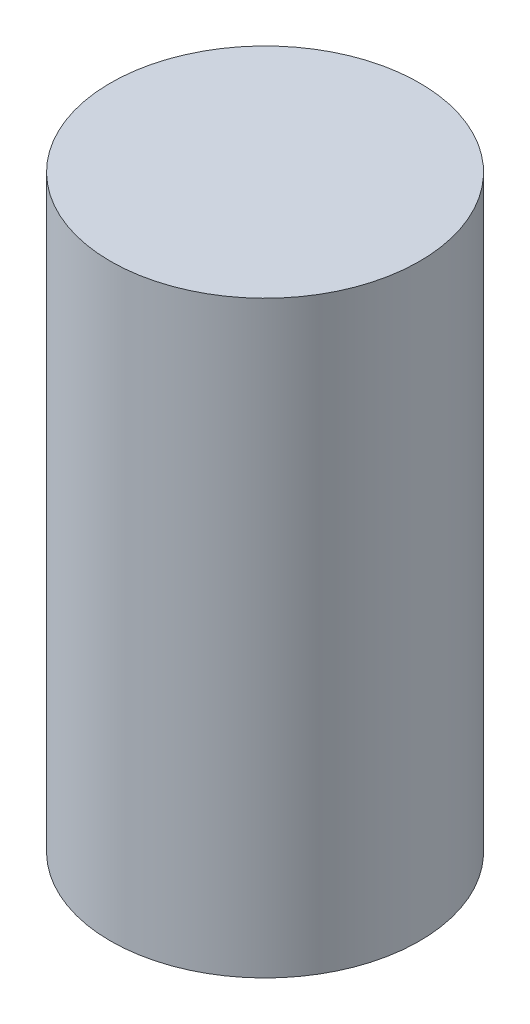
ISO-10303-21;
HEADER;
FILE_DESCRIPTION(('STEP AP214'),'2;1');
FILE_NAME('part.step','',(''),(''),'','','');
FILE_SCHEMA(('AUTOMOTIVE_DESIGN { 1 0 10303 214 1 1 1 1 }'));
ENDSEC;
DATA;
#1=APPLICATION_CONTEXT('core data for automotive mechanical design processes');
#2=APPLICATION_PROTOCOL_DEFINITION('international standard','automotive_design',2000,#1);
#3=PRODUCT_CONTEXT('',#1,'mechanical');
#4=PRODUCT('Part','Part','',(#3));
#5=PRODUCT_RELATED_PRODUCT_CATEGORY('part','',(#4));
#6=PRODUCT_DEFINITION_FORMATION('','',#4);
#7=PRODUCT_DEFINITION_CONTEXT('part definition',#1,'design');
#8=PRODUCT_DEFINITION('design','',#6,#7);
#9=PRODUCT_DEFINITION_SHAPE('','',#8);
#10=(LENGTH_UNIT() NAMED_UNIT(*) SI_UNIT(.MILLI.,.METRE.));
#11=(NAMED_UNIT(*) PLANE_ANGLE_UNIT() SI_UNIT($,.RADIAN.));
#12=(NAMED_UNIT(*) SI_UNIT($,.STERADIAN.) SOLID_ANGLE_UNIT());
#13=UNCERTAINTY_MEASURE_WITH_UNIT(LENGTH_MEASURE(1.E-05),#10,'distance_accuracy_value','');
#14=(GEOMETRIC_REPRESENTATION_CONTEXT(3) GLOBAL_UNCERTAINTY_ASSIGNED_CONTEXT((#13)) GLOBAL_UNIT_ASSIGNED_CONTEXT((#10,
#11,#12)) REPRESENTATION_CONTEXT('',''));
#15=CARTESIAN_POINT('',(0.,0.,0.));
#16=DIRECTION('',(0.,0.,1.));
#17=DIRECTION('',(1.,0.,0.));
#18=AXIS2_PLACEMENT_3D('',#15,#16,#17);
#19=CARTESIAN_POINT('',(0.,40.,0.));
#20=DIRECTION('',(0.,-1.,0.));
#21=DIRECTION('',(0.,0.,-1.));
#22=AXIS2_PLACEMENT_3D('',#19,#20,#21);
#23=CYLINDRICAL_SURFACE('',#22,10.5);
#24=CARTESIAN_POINT('',(0.,40.,0.));
#25=DIRECTION('',(0.,1.,0.));
#26=DIRECTION('',(0.,0.,1.));
#27=AXIS2_PLACEMENT_3D('',#24,#25,#26);
#28=CIRCLE('',#27,10.5);
#29=CARTESIAN_POINT('',(0.,40.,10.5));
#30=VERTEX_POINT('',#29);
#31=EDGE_CURVE('E10',#30,#30,#28,.T.);
#32=ORIENTED_EDGE('',*,*,#31,.F.);
#33=EDGE_LOOP('',(#32));
#34=FACE_BOUND('',#33,.T.);
#35=CARTESIAN_POINT('',(0.,0.,0.));
#36=DIRECTION('',(0.,1.,0.));
#37=DIRECTION('',(0.,0.,1.));
#38=AXIS2_PLACEMENT_3D('',#35,#36,#37);
#39=CIRCLE('',#38,10.5);
#40=CARTESIAN_POINT('',(0.,0.,10.5));
#41=VERTEX_POINT('',#40);
#42=EDGE_CURVE('E34',#41,#41,#39,.T.);
#43=ORIENTED_EDGE('',*,*,#42,.T.);
#44=EDGE_LOOP('',(#43));
#45=FACE_BOUND('',#44,.T.);
#46=ADVANCED_FACE('F31',(#34,#45),#23,.T.);
#47=CARTESIAN_POINT('',(0.,40.,0.));
#48=DIRECTION('',(0.,1.,0.));
#49=DIRECTION('',(0.,0.,1.));
#50=AXIS2_PLACEMENT_3D('',#47,#48,#49);
#51=PLANE('',#50);
#52=ORIENTED_EDGE('',*,*,#31,.T.);
#53=EDGE_LOOP('',(#52));
#54=FACE_BOUND('',#53,.T.);
#55=ADVANCED_FACE('F46',(#54),#51,.T.);
#56=CARTESIAN_POINT('',(0.,0.,0.));
#57=DIRECTION('',(0.,1.,0.));
#58=DIRECTION('',(0.,0.,1.));
#59=AXIS2_PLACEMENT_3D('',#56,#57,#58);
#60=PLANE('',#59);
#61=ORIENTED_EDGE('',*,*,#42,.F.);
#62=EDGE_LOOP('',(#61));
#63=FACE_BOUND('',#62,.T.);
#64=ADVANCED_FACE('F44',(#63),#60,.F.);
#65=CLOSED_SHELL('',(#46,#55,#64));
#66=MANIFOLD_SOLID_BREP('B2',#65);
#67=ADVANCED_BREP_SHAPE_REPRESENTATION('',(#18,#66),#14);
#68=SHAPE_DEFINITION_REPRESENTATION(#9,#67);
ENDSEC;
END-ISO-10303-21;
